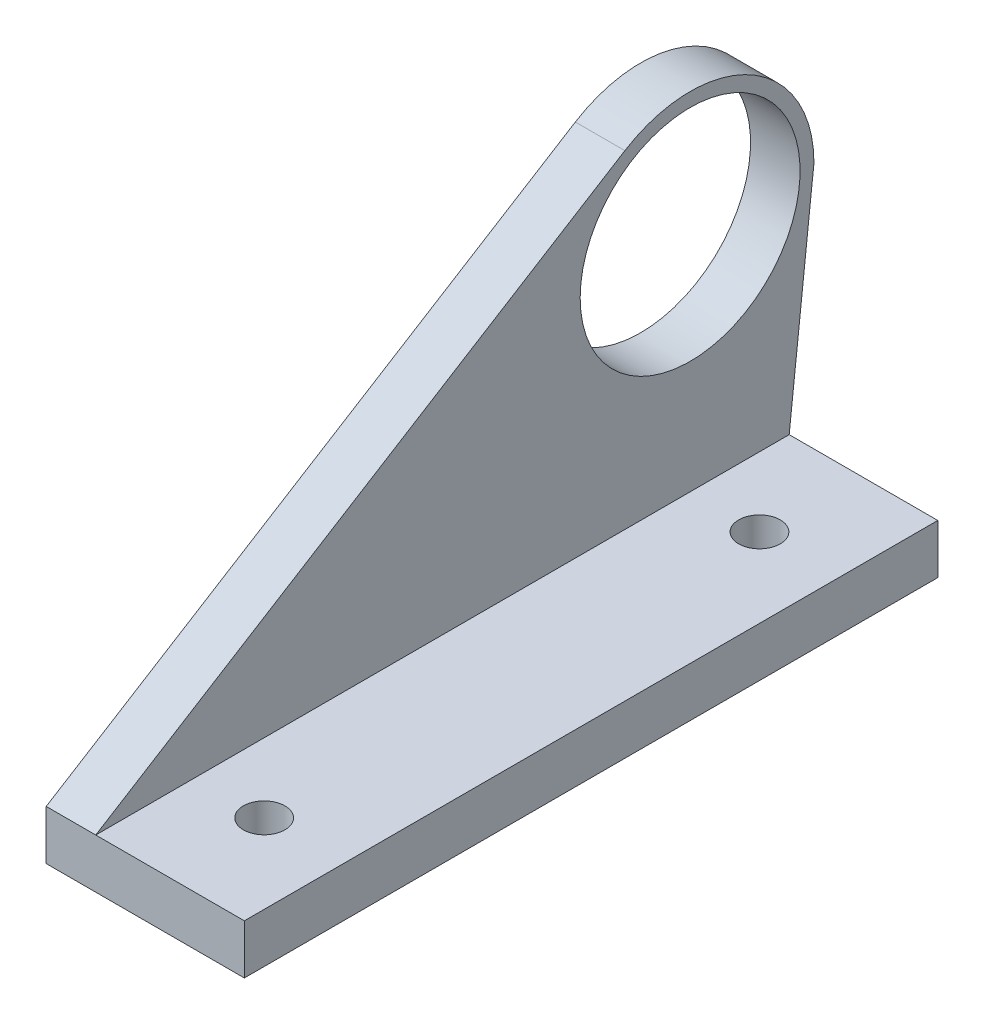
ISO-10303-21;
HEADER;
FILE_DESCRIPTION(('STEP AP214'),'2;1');
FILE_NAME('part.step','',(''),(''),'','','');
FILE_SCHEMA(('AUTOMOTIVE_DESIGN { 1 0 10303 214 1 1 1 1 }'));
ENDSEC;
DATA;
#1=APPLICATION_CONTEXT('core data for automotive mechanical design processes');
#2=APPLICATION_PROTOCOL_DEFINITION('international standard','automotive_design',2000,#1);
#3=PRODUCT_CONTEXT('',#1,'mechanical');
#4=PRODUCT('Part','Part','',(#3));
#5=PRODUCT_RELATED_PRODUCT_CATEGORY('part','',(#4));
#6=PRODUCT_DEFINITION_FORMATION('','',#4);
#7=PRODUCT_DEFINITION_CONTEXT('part definition',#1,'design');
#8=PRODUCT_DEFINITION('design','',#6,#7);
#9=PRODUCT_DEFINITION_SHAPE('','',#8);
#10=(LENGTH_UNIT() NAMED_UNIT(*) SI_UNIT(.MILLI.,.METRE.));
#11=(NAMED_UNIT(*) PLANE_ANGLE_UNIT() SI_UNIT($,.RADIAN.));
#12=(NAMED_UNIT(*) SI_UNIT($,.STERADIAN.) SOLID_ANGLE_UNIT());
#13=UNCERTAINTY_MEASURE_WITH_UNIT(LENGTH_MEASURE(1.E-05),#10,'distance_accuracy_value','');
#14=(GEOMETRIC_REPRESENTATION_CONTEXT(3) GLOBAL_UNCERTAINTY_ASSIGNED_CONTEXT((#13)) GLOBAL_UNIT_ASSIGNED_CONTEXT((#10,
#11,#12)) REPRESENTATION_CONTEXT('',''));
#15=CARTESIAN_POINT('',(0.,0.,0.));
#16=DIRECTION('',(0.,0.,1.));
#17=DIRECTION('',(1.,0.,0.));
#18=AXIS2_PLACEMENT_3D('',#15,#16,#17);
#19=CARTESIAN_POINT('',(0.,5000.,0.));
#20=DIRECTION('',(0.,1.,0.));
#21=DIRECTION('',(0.,0.,1.));
#22=AXIS2_PLACEMENT_3D('',#19,#20,#21);
#23=PLANE('',#22);
#24=DIRECTION('',(0.,0.,-1.));
#25=VECTOR('',#24,1.);
#26=CARTESIAN_POINT('',(-5000.,5000.,8.73110448020029E-13));
#27=LINE('',#26,#25);
#28=CARTESIAN_POINT('',(-5000.,5000.,35000.));
#29=VERTEX_POINT('',#28);
#30=CARTESIAN_POINT('',(-5000.,5000.,-35000.));
#31=VERTEX_POINT('',#30);
#32=EDGE_CURVE('E50',#29,#31,#27,.T.);
#33=ORIENTED_EDGE('',*,*,#32,.F.);
#34=DIRECTION('',(1.,0.,0.));
#35=VECTOR('',#34,1.);
#36=CARTESIAN_POINT('',(-9999.99999999999,5000.,35000.));
#37=LINE('',#36,#35);
#38=CARTESIAN_POINT('',(10000.,5000.,35000.));
#39=VERTEX_POINT('',#38);
#40=EDGE_CURVE('E55',#29,#39,#37,.T.);
#41=ORIENTED_EDGE('',*,*,#40,.T.);
#42=DIRECTION('',(0.,0.,-1.));
#43=VECTOR('',#42,1.);
#44=CARTESIAN_POINT('',(10000.,5000.,-35000.));
#45=LINE('',#44,#43);
#46=CARTESIAN_POINT('',(10000.,5000.,-35000.));
#47=VERTEX_POINT('',#46);
#48=EDGE_CURVE('E152',#39,#47,#45,.T.);
#49=ORIENTED_EDGE('',*,*,#48,.T.);
#50=DIRECTION('',(-1.,0.,0.));
#51=VECTOR('',#50,1.);
#52=CARTESIAN_POINT('',(-10000.,5000.,-35000.));
#53=LINE('',#52,#51);
#54=EDGE_CURVE('E83',#47,#31,#53,.T.);
#55=ORIENTED_EDGE('',*,*,#54,.T.);
#56=EDGE_LOOP('',(#33,#41,#49,#55));
#57=FACE_BOUND('',#56,.T.);
#58=CARTESIAN_POINT('',(2000.,5000.,-25000.));
#59=DIRECTION('',(0.,1.,0.));
#60=DIRECTION('',(0.,0.,1.));
#61=AXIS2_PLACEMENT_3D('',#58,#59,#60);
#62=CIRCLE('',#61,2100.);
#63=CARTESIAN_POINT('',(2000.,5000.,-22900.));
#64=VERTEX_POINT('',#63);
#65=EDGE_CURVE('E146',#64,#64,#62,.T.);
#66=ORIENTED_EDGE('',*,*,#65,.F.);
#67=EDGE_LOOP('',(#66));
#68=FACE_BOUND('',#67,.T.);
#69=CARTESIAN_POINT('',(2000.,5000.,25000.));
#70=DIRECTION('',(0.,1.,0.));
#71=DIRECTION('',(0.,0.,1.));
#72=AXIS2_PLACEMENT_3D('',#69,#70,#71);
#73=CIRCLE('',#72,2100.);
#74=CARTESIAN_POINT('',(2000.,5000.,27100.));
#75=VERTEX_POINT('',#74);
#76=EDGE_CURVE('E140',#75,#75,#73,.T.);
#77=ORIENTED_EDGE('',*,*,#76,.F.);
#78=EDGE_LOOP('',(#77));
#79=FACE_BOUND('',#78,.T.);
#80=ADVANCED_FACE('F35',(#57,#68,#79),#23,.T.);
#81=CARTESIAN_POINT('',(0.,0.,0.));
#82=DIRECTION('',(0.,1.,0.));
#83=DIRECTION('',(0.,0.,1.));
#84=AXIS2_PLACEMENT_3D('',#81,#82,#83);
#85=PLANE('',#84);
#86=DIRECTION('',(0.,0.,-1.));
#87=VECTOR('',#86,1.);
#88=CARTESIAN_POINT('',(10000.,0.,-35000.));
#89=LINE('',#88,#87);
#90=CARTESIAN_POINT('',(10000.,0.,35000.));
#91=VERTEX_POINT('',#90);
#92=CARTESIAN_POINT('',(10000.,0.,-35000.));
#93=VERTEX_POINT('',#92);
#94=EDGE_CURVE('E149',#91,#93,#89,.T.);
#95=ORIENTED_EDGE('',*,*,#94,.F.);
#96=DIRECTION('',(1.,0.,0.));
#97=VECTOR('',#96,1.);
#98=CARTESIAN_POINT('',(-9999.99999999999,0.,35000.));
#99=LINE('',#98,#97);
#100=CARTESIAN_POINT('',(-9999.99999999999,0.,35000.));
#101=VERTEX_POINT('',#100);
#102=EDGE_CURVE('E77',#101,#91,#99,.T.);
#103=ORIENTED_EDGE('',*,*,#102,.F.);
#104=DIRECTION('',(0.,0.,1.));
#105=VECTOR('',#104,1.);
#106=CARTESIAN_POINT('',(-10000.,0.,-35000.));
#107=LINE('',#106,#105);
#108=CARTESIAN_POINT('',(-10000.,0.,-35000.));
#109=VERTEX_POINT('',#108);
#110=EDGE_CURVE('E163',#109,#101,#107,.T.);
#111=ORIENTED_EDGE('',*,*,#110,.F.);
#112=DIRECTION('',(-1.,0.,0.));
#113=VECTOR('',#112,1.);
#114=CARTESIAN_POINT('',(-10000.,0.,-35000.));
#115=LINE('',#114,#113);
#116=EDGE_CURVE('E161',#93,#109,#115,.T.);
#117=ORIENTED_EDGE('',*,*,#116,.F.);
#118=EDGE_LOOP('',(#95,#103,#111,#117));
#119=FACE_BOUND('',#118,.T.);
#120=CARTESIAN_POINT('',(2000.,0.,-25000.));
#121=DIRECTION('',(0.,1.,0.));
#122=DIRECTION('',(0.,0.,1.));
#123=AXIS2_PLACEMENT_3D('',#120,#121,#122);
#124=CIRCLE('',#123,2100.);
#125=CARTESIAN_POINT('',(2000.,0.,-22900.));
#126=VERTEX_POINT('',#125);
#127=EDGE_CURVE('E143',#126,#126,#124,.T.);
#128=ORIENTED_EDGE('',*,*,#127,.T.);
#129=EDGE_LOOP('',(#128));
#130=FACE_BOUND('',#129,.T.);
#131=CARTESIAN_POINT('',(2000.,0.,25000.));
#132=DIRECTION('',(0.,1.,0.));
#133=DIRECTION('',(0.,0.,1.));
#134=AXIS2_PLACEMENT_3D('',#131,#132,#133);
#135=CIRCLE('',#134,2100.);
#136=CARTESIAN_POINT('',(2000.,0.,27100.));
#137=VERTEX_POINT('',#136);
#138=EDGE_CURVE('E138',#137,#137,#135,.T.);
#139=ORIENTED_EDGE('',*,*,#138,.T.);
#140=EDGE_LOOP('',(#139));
#141=FACE_BOUND('',#140,.T.);
#142=ADVANCED_FACE('F175',(#119,#130,#141),#85,.F.);
#143=CARTESIAN_POINT('',(10000.,5000.,-35000.));
#144=DIRECTION('',(-1.,0.,0.));
#145=DIRECTION('',(0.,0.,1.));
#146=AXIS2_PLACEMENT_3D('',#143,#144,#145);
#147=PLANE('',#146);
#148=ORIENTED_EDGE('',*,*,#94,.T.);
#149=DIRECTION('',(0.,-1.,0.));
#150=VECTOR('',#149,1.);
#151=CARTESIAN_POINT('',(10000.,5000.,-35000.));
#152=LINE('',#151,#150);
#153=EDGE_CURVE('E11',#47,#93,#152,.T.);
#154=ORIENTED_EDGE('',*,*,#153,.F.);
#155=ORIENTED_EDGE('',*,*,#48,.F.);
#156=DIRECTION('',(0.,-1.,0.));
#157=VECTOR('',#156,1.);
#158=CARTESIAN_POINT('',(10000.,5000.,35000.));
#159=LINE('',#158,#157);
#160=EDGE_CURVE('E158',#39,#91,#159,.T.);
#161=ORIENTED_EDGE('',*,*,#160,.T.);
#162=EDGE_LOOP('',(#148,#154,#155,#161));
#163=FACE_BOUND('',#162,.T.);
#164=ADVANCED_FACE('F37',(#163),#147,.F.);
#165=CARTESIAN_POINT('',(-10000.,5000.,-35000.));
#166=DIRECTION('',(0.,0.,1.));
#167=DIRECTION('',(1.,0.,0.));
#168=AXIS2_PLACEMENT_3D('',#165,#166,#167);
#169=PLANE('',#168);
#170=ORIENTED_EDGE('',*,*,#116,.T.);
#171=DIRECTION('',(0.,-1.,0.));
#172=VECTOR('',#171,1.);
#173=CARTESIAN_POINT('',(-10000.,5000.,-35000.));
#174=LINE('',#173,#172);
#175=CARTESIAN_POINT('',(-10000.,5000.,-35000.));
#176=VERTEX_POINT('',#175);
#177=EDGE_CURVE('E43',#176,#109,#174,.T.);
#178=ORIENTED_EDGE('',*,*,#177,.F.);
#179=DIRECTION('',(-1.,0.,0.));
#180=VECTOR('',#179,1.);
#181=CARTESIAN_POINT('',(-5000.,5000.,-35000.));
#182=LINE('',#181,#180);
#183=EDGE_CURVE('E133',#31,#176,#182,.T.);
#184=ORIENTED_EDGE('',*,*,#183,.F.);
#185=ORIENTED_EDGE('',*,*,#54,.F.);
#186=ORIENTED_EDGE('',*,*,#153,.T.);
#187=EDGE_LOOP('',(#170,#178,#184,#185,#186));
#188=FACE_BOUND('',#187,.T.);
#189=ADVANCED_FACE('F193',(#188),#169,.F.);
#190=CARTESIAN_POINT('',(-10000.,5000.,-35000.));
#191=DIRECTION('',(1.,0.,0.));
#192=DIRECTION('',(0.,0.,-1.));
#193=AXIS2_PLACEMENT_3D('',#190,#191,#192);
#194=PLANE('',#193);
#195=ORIENTED_EDGE('',*,*,#110,.T.);
#196=DIRECTION('',(0.,-1.,0.));
#197=VECTOR('',#196,1.);
#198=CARTESIAN_POINT('',(-9999.99999999999,5000.,35000.));
#199=LINE('',#198,#197);
#200=CARTESIAN_POINT('',(-9999.99999999999,5000.,35000.));
#201=VERTEX_POINT('',#200);
#202=EDGE_CURVE('E167',#201,#101,#199,.T.);
#203=ORIENTED_EDGE('',*,*,#202,.F.);
#204=DIRECTION('',(0.,0.527026623469677,-0.849848773696916));
#205=VECTOR('',#204,1.);
#206=CARTESIAN_POINT('',(-10000.,19287.4672289173,11960.9618129114));
#207=LINE('',#206,#205);
#208=CARTESIAN_POINT('',(-10000.,38123.1096712115,-18412.167206629));
#209=VERTEX_POINT('',#208);
#210=EDGE_CURVE('E110',#201,#209,#207,.T.);
#211=ORIENTED_EDGE('',*,*,#210,.T.);
#212=CARTESIAN_POINT('',(-10000.,27500.,-25000.));
#213=DIRECTION('',(-1.,0.,0.));
#214=DIRECTION('',(0.,0.,1.));
#215=AXIS2_PLACEMENT_3D('',#212,#213,#214);
#216=CIRCLE('',#215,12500.);
#217=CARTESIAN_POINT('',(-10000.,27500.,-37500.));
#218=VERTEX_POINT('',#217);
#219=EDGE_CURVE('E128',#209,#218,#216,.T.);
#220=ORIENTED_EDGE('',*,*,#219,.T.);
#221=DIRECTION('',(0.,0.993883734673619,-0.110431526074847));
#222=VECTOR('',#221,1.);
#223=CARTESIAN_POINT('',(-10000.,-3780.48780487805,-34024.3902439024));
#224=LINE('',#223,#222);
#225=EDGE_CURVE('E123',#176,#218,#224,.T.);
#226=ORIENTED_EDGE('',*,*,#225,.F.);
#227=ORIENTED_EDGE('',*,*,#177,.T.);
#228=EDGE_LOOP('',(#195,#203,#211,#220,#226,#227));
#229=FACE_BOUND('',#228,.T.);
#230=CARTESIAN_POINT('',(-10000.,27500.,-25000.));
#231=DIRECTION('',(-1.,0.,0.));
#232=DIRECTION('',(0.,0.,1.));
#233=AXIS2_PLACEMENT_3D('',#230,#231,#232);
#234=CIRCLE('',#233,11100.);
#235=CARTESIAN_POINT('',(-10000.,27500.,-13900.));
#236=VERTEX_POINT('',#235);
#237=EDGE_CURVE('E185',#236,#236,#234,.T.);
#238=ORIENTED_EDGE('',*,*,#237,.F.);
#239=EDGE_LOOP('',(#238));
#240=FACE_BOUND('',#239,.T.);
#241=ADVANCED_FACE('F171',(#229,#240),#194,.F.);
#242=CARTESIAN_POINT('',(-9999.99999999999,5000.,35000.));
#243=DIRECTION('',(0.,0.,-1.));
#244=DIRECTION('',(-1.,0.,0.));
#245=AXIS2_PLACEMENT_3D('',#242,#243,#244);
#246=PLANE('',#245);
#247=ORIENTED_EDGE('',*,*,#102,.T.);
#248=ORIENTED_EDGE('',*,*,#160,.F.);
#249=ORIENTED_EDGE('',*,*,#40,.F.);
#250=EDGE_CURVE('E155',#201,#29,#37,.T.);
#251=ORIENTED_EDGE('',*,*,#250,.F.);
#252=ORIENTED_EDGE('',*,*,#202,.T.);
#253=EDGE_LOOP('',(#247,#248,#249,#251,#252));
#254=FACE_BOUND('',#253,.T.);
#255=ADVANCED_FACE('F180',(#254),#246,.F.);
#256=CARTESIAN_POINT('',(2000.,5000.,-25000.));
#257=DIRECTION('',(0.,-1.,0.));
#258=DIRECTION('',(0.,0.,-1.));
#259=AXIS2_PLACEMENT_3D('',#256,#257,#258);
#260=CYLINDRICAL_SURFACE('',#259,2100.);
#261=ORIENTED_EDGE('',*,*,#65,.T.);
#262=EDGE_LOOP('',(#261));
#263=FACE_BOUND('',#262,.T.);
#264=ORIENTED_EDGE('',*,*,#127,.F.);
#265=EDGE_LOOP('',(#264));
#266=FACE_BOUND('',#265,.T.);
#267=ADVANCED_FACE('F199',(#263,#266),#260,.F.);
#268=CARTESIAN_POINT('',(2000.,5000.,25000.));
#269=DIRECTION('',(0.,-1.,0.));
#270=DIRECTION('',(0.,0.,-1.));
#271=AXIS2_PLACEMENT_3D('',#268,#269,#270);
#272=CYLINDRICAL_SURFACE('',#271,2100.);
#273=ORIENTED_EDGE('',*,*,#76,.T.);
#274=EDGE_LOOP('',(#273));
#275=FACE_BOUND('',#274,.T.);
#276=ORIENTED_EDGE('',*,*,#138,.F.);
#277=EDGE_LOOP('',(#276));
#278=FACE_BOUND('',#277,.T.);
#279=ADVANCED_FACE('F211',(#275,#278),#272,.F.);
#280=CARTESIAN_POINT('',(-5000.,19287.4672289173,11960.9618129114));
#281=DIRECTION('',(0.,0.849848773696916,0.527026623469677));
#282=DIRECTION('',(0.,-0.527026623469677,0.849848773696916));
#283=AXIS2_PLACEMENT_3D('',#280,#281,#282);
#284=PLANE('',#283);
#285=ORIENTED_EDGE('',*,*,#210,.F.);
#286=ORIENTED_EDGE('',*,*,#250,.T.);
#287=DIRECTION('',(0.,0.527026623469677,-0.849848773696916));
#288=VECTOR('',#287,1.);
#289=CARTESIAN_POINT('',(-5000.,19287.4672289173,11960.9618129114));
#290=LINE('',#289,#288);
#291=CARTESIAN_POINT('',(-5000.,38123.1096712115,-18412.167206629));
#292=VERTEX_POINT('',#291);
#293=EDGE_CURVE('E132',#29,#292,#290,.T.);
#294=ORIENTED_EDGE('',*,*,#293,.T.);
#295=DIRECTION('',(-1.,0.,0.));
#296=VECTOR('',#295,1.);
#297=CARTESIAN_POINT('',(-5000.,38123.1096712115,-18412.167206629));
#298=LINE('',#297,#296);
#299=EDGE_CURVE('E117',#292,#209,#298,.T.);
#300=ORIENTED_EDGE('',*,*,#299,.T.);
#301=EDGE_LOOP('',(#285,#286,#294,#300));
#302=FACE_BOUND('',#301,.T.);
#303=ADVANCED_FACE('F184',(#302),#284,.T.);
#304=CARTESIAN_POINT('',(-5000.,-3780.48780487805,-34024.3902439024));
#305=DIRECTION('',(0.,0.110431526074847,0.993883734673619));
#306=DIRECTION('',(0.,-0.993883734673619,0.110431526074847));
#307=AXIS2_PLACEMENT_3D('',#304,#305,#306);
#308=PLANE('',#307);
#309=ORIENTED_EDGE('',*,*,#225,.T.);
#310=DIRECTION('',(-1.,0.,0.));
#311=VECTOR('',#310,1.);
#312=CARTESIAN_POINT('',(-5000.,27500.,-37500.));
#313=LINE('',#312,#311);
#314=CARTESIAN_POINT('',(-5000.,27500.,-37500.));
#315=VERTEX_POINT('',#314);
#316=EDGE_CURVE('E115',#315,#218,#313,.T.);
#317=ORIENTED_EDGE('',*,*,#316,.F.);
#318=DIRECTION('',(0.,0.993883734673619,-0.110431526074847));
#319=VECTOR('',#318,1.);
#320=CARTESIAN_POINT('',(-5000.,-3780.48780487805,-34024.3902439024));
#321=LINE('',#320,#319);
#322=EDGE_CURVE('E100',#31,#315,#321,.T.);
#323=ORIENTED_EDGE('',*,*,#322,.F.);
#324=ORIENTED_EDGE('',*,*,#183,.T.);
#325=EDGE_LOOP('',(#309,#317,#323,#324));
#326=FACE_BOUND('',#325,.T.);
#327=ADVANCED_FACE('F121',(#326),#308,.F.);
#328=CARTESIAN_POINT('',(-5000.,0.,8.73110448020029E-13));
#329=DIRECTION('',(-1.,0.,0.));
#330=DIRECTION('',(0.,0.,1.));
#331=AXIS2_PLACEMENT_3D('',#328,#329,#330);
#332=PLANE('',#331);
#333=ORIENTED_EDGE('',*,*,#322,.T.);
#334=CARTESIAN_POINT('',(-5000.,27500.,-25000.));
#335=DIRECTION('',(-1.,0.,0.));
#336=DIRECTION('',(0.,0.,1.));
#337=AXIS2_PLACEMENT_3D('',#334,#335,#336);
#338=CIRCLE('',#337,12500.);
#339=EDGE_CURVE('E105',#292,#315,#338,.T.);
#340=ORIENTED_EDGE('',*,*,#339,.F.);
#341=ORIENTED_EDGE('',*,*,#293,.F.);
#342=ORIENTED_EDGE('',*,*,#32,.T.);
#343=EDGE_LOOP('',(#333,#340,#341,#342));
#344=FACE_BOUND('',#343,.T.);
#345=CARTESIAN_POINT('',(-5000.,27500.,-25000.));
#346=DIRECTION('',(-1.,0.,0.));
#347=DIRECTION('',(0.,0.,1.));
#348=AXIS2_PLACEMENT_3D('',#345,#346,#347);
#349=CIRCLE('',#348,11100.);
#350=CARTESIAN_POINT('',(-5000.,27500.,-13900.));
#351=VERTEX_POINT('',#350);
#352=EDGE_CURVE('E119',#351,#351,#349,.T.);
#353=ORIENTED_EDGE('',*,*,#352,.T.);
#354=EDGE_LOOP('',(#353));
#355=FACE_BOUND('',#354,.T.);
#356=ADVANCED_FACE('F102',(#344,#355),#332,.F.);
#357=CARTESIAN_POINT('',(-5000.,27500.,-25000.));
#358=DIRECTION('',(-1.,0.,0.));
#359=DIRECTION('',(0.,0.,1.));
#360=AXIS2_PLACEMENT_3D('',#357,#358,#359);
#361=CYLINDRICAL_SURFACE('',#360,12500.);
#362=ORIENTED_EDGE('',*,*,#299,.F.);
#363=ORIENTED_EDGE('',*,*,#339,.T.);
#364=ORIENTED_EDGE('',*,*,#316,.T.);
#365=ORIENTED_EDGE('',*,*,#219,.F.);
#366=EDGE_LOOP('',(#362,#363,#364,#365));
#367=FACE_BOUND('',#366,.T.);
#368=ADVANCED_FACE('F114',(#367),#361,.T.);
#369=CARTESIAN_POINT('',(-5000.,27500.,-25000.));
#370=DIRECTION('',(-1.,0.,0.));
#371=DIRECTION('',(0.,0.,1.));
#372=AXIS2_PLACEMENT_3D('',#369,#370,#371);
#373=CYLINDRICAL_SURFACE('',#372,11100.);
#374=ORIENTED_EDGE('',*,*,#352,.F.);
#375=EDGE_LOOP('',(#374));
#376=FACE_BOUND('',#375,.T.);
#377=ORIENTED_EDGE('',*,*,#237,.T.);
#378=EDGE_LOOP('',(#377));
#379=FACE_BOUND('',#378,.T.);
#380=ADVANCED_FACE('F191',(#376,#379),#373,.F.);
#381=CLOSED_SHELL('',(#80,#142,#164,#189,#241,#255,#267,#279,#303,#327,#356,#368,#380));
#382=MANIFOLD_SOLID_BREP('B2',#381);
#383=ADVANCED_BREP_SHAPE_REPRESENTATION('',(#18,#382),#14);
#384=SHAPE_DEFINITION_REPRESENTATION(#9,#383);
ENDSEC;
END-ISO-10303-21;
